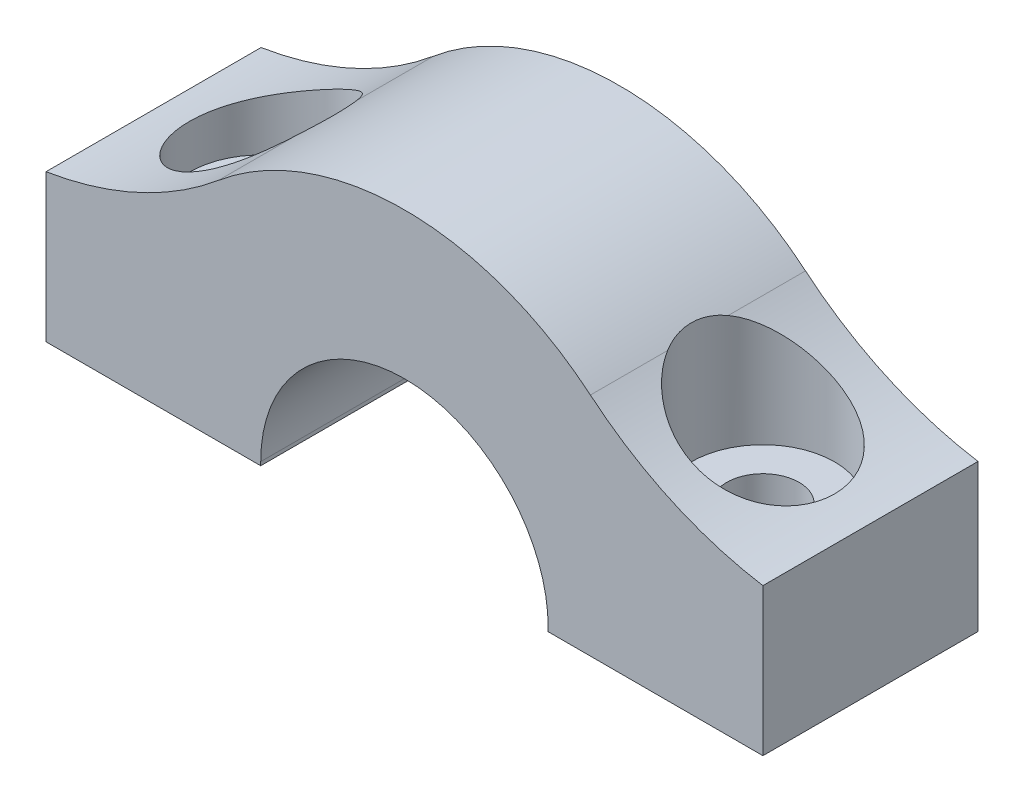
ISO-10303-21;
HEADER;
FILE_DESCRIPTION(('STEP AP214'),'2;1');
FILE_NAME('part.step','',(''),(''),'','','');
FILE_SCHEMA(('AUTOMOTIVE_DESIGN { 1 0 10303 214 1 1 1 1 }'));
ENDSEC;
DATA;
#1=APPLICATION_CONTEXT('core data for automotive mechanical design processes');
#2=APPLICATION_PROTOCOL_DEFINITION('international standard','automotive_design',2000,#1);
#3=PRODUCT_CONTEXT('',#1,'mechanical');
#4=PRODUCT('Part','Part','',(#3));
#5=PRODUCT_RELATED_PRODUCT_CATEGORY('part','',(#4));
#6=PRODUCT_DEFINITION_FORMATION('','',#4);
#7=PRODUCT_DEFINITION_CONTEXT('part definition',#1,'design');
#8=PRODUCT_DEFINITION('design','',#6,#7);
#9=PRODUCT_DEFINITION_SHAPE('','',#8);
#10=(LENGTH_UNIT() NAMED_UNIT(*) SI_UNIT(.MILLI.,.METRE.));
#11=(NAMED_UNIT(*) PLANE_ANGLE_UNIT() SI_UNIT($,.RADIAN.));
#12=(NAMED_UNIT(*) SI_UNIT($,.STERADIAN.) SOLID_ANGLE_UNIT());
#13=UNCERTAINTY_MEASURE_WITH_UNIT(LENGTH_MEASURE(1.E-05),#10,'distance_accuracy_value','');
#14=(GEOMETRIC_REPRESENTATION_CONTEXT(3) GLOBAL_UNCERTAINTY_ASSIGNED_CONTEXT((#13)) GLOBAL_UNIT_ASSIGNED_CONTEXT((#10,
#11,#12)) REPRESENTATION_CONTEXT('',''));
#15=CARTESIAN_POINT('',(0.,0.,0.));
#16=DIRECTION('',(0.,0.,1.));
#17=DIRECTION('',(1.,0.,0.));
#18=AXIS2_PLACEMENT_3D('',#15,#16,#17);
#19=CARTESIAN_POINT('',(0.,4.01,0.));
#20=DIRECTION('',(1.,0.,0.));
#21=DIRECTION('',(0.,0.,-1.));
#22=AXIS2_PLACEMENT_3D('',#19,#20,#21);
#23=PLANE('',#22);
#24=DIRECTION('',(0.,-1.,0.));
#25=VECTOR('',#24,1.);
#26=CARTESIAN_POINT('',(0.,4.01,-6.));
#27=LINE('',#26,#25);
#28=CARTESIAN_POINT('',(0.,4.01,-6.));
#29=VERTEX_POINT('',#28);
#30=CARTESIAN_POINT('',(0.,-0.1,-6.));
#31=VERTEX_POINT('',#30);
#32=EDGE_CURVE('E286',#29,#31,#27,.T.);
#33=ORIENTED_EDGE('',*,*,#32,.T.);
#34=DIRECTION('',(0.,0.,-1.));
#35=VECTOR('',#34,1.);
#36=CARTESIAN_POINT('',(0.,-0.1,0.));
#37=LINE('',#36,#35);
#38=CARTESIAN_POINT('',(0.,-0.1,0.));
#39=VERTEX_POINT('',#38);
#40=EDGE_CURVE('E176',#39,#31,#37,.T.);
#41=ORIENTED_EDGE('',*,*,#40,.F.);
#42=DIRECTION('',(0.,-1.,0.));
#43=VECTOR('',#42,1.);
#44=CARTESIAN_POINT('',(0.,4.01,0.));
#45=LINE('',#44,#43);
#46=CARTESIAN_POINT('',(0.,4.01,0.));
#47=VERTEX_POINT('',#46);
#48=EDGE_CURVE('E278',#47,#39,#45,.T.);
#49=ORIENTED_EDGE('',*,*,#48,.F.);
#50=DIRECTION('',(0.,0.,1.));
#51=VECTOR('',#50,1.);
#52=CARTESIAN_POINT('',(0.,4.01,0.));
#53=LINE('',#52,#51);
#54=EDGE_CURVE('E293',#29,#47,#53,.T.);
#55=ORIENTED_EDGE('',*,*,#54,.F.);
#56=EDGE_LOOP('',(#33,#41,#49,#55));
#57=FACE_BOUND('',#56,.T.);
#58=ADVANCED_FACE('F44',(#57),#23,.F.);
#59=CARTESIAN_POINT('',(0.,4.01,0.));
#60=DIRECTION('',(0.,0.,-1.));
#61=DIRECTION('',(-1.,0.,0.));
#62=AXIS2_PLACEMENT_3D('',#59,#60,#61);
#63=PLANE('',#62);
#64=CARTESIAN_POINT('',(10.,0.,0.));
#65=DIRECTION('',(0.,0.,1.));
#66=DIRECTION('',(1.,0.,0.));
#67=AXIS2_PLACEMENT_3D('',#64,#65,#66);
#68=CIRCLE('',#67,4.01);
#69=CARTESIAN_POINT('',(14.01,0.,0.));
#70=VERTEX_POINT('',#69);
#71=CARTESIAN_POINT('',(5.99,0.,0.));
#72=VERTEX_POINT('',#71);
#73=EDGE_CURVE('E307',#70,#72,#68,.T.);
#74=ORIENTED_EDGE('',*,*,#73,.F.);
#75=DIRECTION('',(0.,1.,0.));
#76=VECTOR('',#75,1.);
#77=CARTESIAN_POINT('',(14.01,-0.1,0.));
#78=LINE('',#77,#76);
#79=CARTESIAN_POINT('',(14.01,-0.1,0.));
#80=VERTEX_POINT('',#79);
#81=EDGE_CURVE('E170',#80,#70,#78,.T.);
#82=ORIENTED_EDGE('',*,*,#81,.F.);
#83=DIRECTION('',(-1.,0.,0.));
#84=VECTOR('',#83,1.);
#85=CARTESIAN_POINT('',(14.01,-0.1,0.));
#86=LINE('',#85,#84);
#87=CARTESIAN_POINT('',(20.,-0.1,0.));
#88=VERTEX_POINT('',#87);
#89=EDGE_CURVE('E158',#88,#80,#86,.T.);
#90=ORIENTED_EDGE('',*,*,#89,.F.);
#91=DIRECTION('',(0.,-1.,0.));
#92=VECTOR('',#91,1.);
#93=CARTESIAN_POINT('',(20.,4.01,0.));
#94=LINE('',#93,#92);
#95=CARTESIAN_POINT('',(20.,4.01,0.));
#96=VERTEX_POINT('',#95);
#97=EDGE_CURVE('E281',#96,#88,#94,.T.);
#98=ORIENTED_EDGE('',*,*,#97,.F.);
#99=CARTESIAN_POINT('',(21.5999229460773,13.8811826326239,0.));
#100=DIRECTION('',(0.,0.,-1.));
#101=DIRECTION('',(-1.,0.,0.));
#102=AXIS2_PLACEMENT_3D('',#99,#100,#101);
#103=CIRCLE('',#102,10.);
#104=CARTESIAN_POINT('',(15.1875569835116,6.20775036524,0.));
#105=VERTEX_POINT('',#104);
#106=EDGE_CURVE('E259',#96,#105,#103,.T.);
#107=ORIENTED_EDGE('',*,*,#106,.T.);
#108=CARTESIAN_POINT('',(10.,0.,0.));
#109=DIRECTION('',(0.,0.,1.));
#110=DIRECTION('',(1.,0.,0.));
#111=AXIS2_PLACEMENT_3D('',#108,#109,#110);
#112=CIRCLE('',#111,8.08992657904365);
#113=CARTESIAN_POINT('',(4.81244301648845,6.20775036524,0.));
#114=VERTEX_POINT('',#113);
#115=EDGE_CURVE('E298',#105,#114,#112,.T.);
#116=ORIENTED_EDGE('',*,*,#115,.T.);
#117=CARTESIAN_POINT('',(-1.59992294607732,13.8811826326239,0.));
#118=DIRECTION('',(0.,0.,-1.));
#119=DIRECTION('',(-1.,0.,0.));
#120=AXIS2_PLACEMENT_3D('',#117,#118,#119);
#121=CIRCLE('',#120,10.);
#122=EDGE_CURVE('E253',#114,#47,#121,.T.);
#123=ORIENTED_EDGE('',*,*,#122,.T.);
#124=ORIENTED_EDGE('',*,*,#48,.T.);
#125=DIRECTION('',(-1.,0.,0.));
#126=VECTOR('',#125,1.);
#127=CARTESIAN_POINT('',(0.,-0.1,0.));
#128=LINE('',#127,#126);
#129=CARTESIAN_POINT('',(5.99,-0.1,0.));
#130=VERTEX_POINT('',#129);
#131=EDGE_CURVE('E191',#130,#39,#128,.T.);
#132=ORIENTED_EDGE('',*,*,#131,.F.);
#133=DIRECTION('',(0.,1.,0.));
#134=VECTOR('',#133,1.);
#135=CARTESIAN_POINT('',(5.99,-0.1,0.));
#136=LINE('',#135,#134);
#137=EDGE_CURVE('E195',#130,#72,#136,.T.);
#138=ORIENTED_EDGE('',*,*,#137,.T.);
#139=EDGE_LOOP('',(#74,#82,#90,#98,#107,#116,#123,#124,#132,#138));
#140=FACE_BOUND('',#139,.T.);
#141=ADVANCED_FACE('F338',(#140),#63,.F.);
#142=CARTESIAN_POINT('',(20.,4.01,0.));
#143=DIRECTION('',(-1.,0.,0.));
#144=DIRECTION('',(0.,0.,1.));
#145=AXIS2_PLACEMENT_3D('',#142,#143,#144);
#146=PLANE('',#145);
#147=ORIENTED_EDGE('',*,*,#97,.T.);
#148=DIRECTION('',(0.,0.,1.));
#149=VECTOR('',#148,1.);
#150=CARTESIAN_POINT('',(20.,-0.1,0.));
#151=LINE('',#150,#149);
#152=CARTESIAN_POINT('',(20.,-0.1,-6.));
#153=VERTEX_POINT('',#152);
#154=EDGE_CURVE('E151',#153,#88,#151,.T.);
#155=ORIENTED_EDGE('',*,*,#154,.F.);
#156=DIRECTION('',(0.,-1.,0.));
#157=VECTOR('',#156,1.);
#158=CARTESIAN_POINT('',(20.,4.01,-6.));
#159=LINE('',#158,#157);
#160=CARTESIAN_POINT('',(20.,4.01,-6.));
#161=VERTEX_POINT('',#160);
#162=EDGE_CURVE('E146',#161,#153,#159,.T.);
#163=ORIENTED_EDGE('',*,*,#162,.F.);
#164=DIRECTION('',(0.,0.,-1.));
#165=VECTOR('',#164,1.);
#166=CARTESIAN_POINT('',(20.,4.01,0.));
#167=LINE('',#166,#165);
#168=EDGE_CURVE('E289',#96,#161,#167,.T.);
#169=ORIENTED_EDGE('',*,*,#168,.F.);
#170=EDGE_LOOP('',(#147,#155,#163,#169));
#171=FACE_BOUND('',#170,.T.);
#172=ADVANCED_FACE('F327',(#171),#146,.F.);
#173=CARTESIAN_POINT('',(0.,4.01,-6.));
#174=DIRECTION('',(0.,0.,1.));
#175=DIRECTION('',(1.,0.,0.));
#176=AXIS2_PLACEMENT_3D('',#173,#174,#175);
#177=PLANE('',#176);
#178=CARTESIAN_POINT('',(10.,0.,-6.));
#179=DIRECTION('',(0.,0.,1.));
#180=DIRECTION('',(1.,0.,0.));
#181=AXIS2_PLACEMENT_3D('',#178,#179,#180);
#182=CIRCLE('',#181,4.01);
#183=CARTESIAN_POINT('',(14.01,0.,-6.));
#184=VERTEX_POINT('',#183);
#185=CARTESIAN_POINT('',(5.99,0.,-6.));
#186=VERTEX_POINT('',#185);
#187=EDGE_CURVE('E302',#184,#186,#182,.T.);
#188=ORIENTED_EDGE('',*,*,#187,.T.);
#189=DIRECTION('',(0.,1.,0.));
#190=VECTOR('',#189,1.);
#191=CARTESIAN_POINT('',(5.99,-0.1,-6.));
#192=LINE('',#191,#190);
#193=CARTESIAN_POINT('',(5.99,-0.1,-6.));
#194=VERTEX_POINT('',#193);
#195=EDGE_CURVE('E199',#194,#186,#192,.T.);
#196=ORIENTED_EDGE('',*,*,#195,.F.);
#197=DIRECTION('',(1.,0.,0.));
#198=VECTOR('',#197,1.);
#199=CARTESIAN_POINT('',(0.,-0.1,-6.));
#200=LINE('',#199,#198);
#201=EDGE_CURVE('E185',#31,#194,#200,.T.);
#202=ORIENTED_EDGE('',*,*,#201,.F.);
#203=ORIENTED_EDGE('',*,*,#32,.F.);
#204=CARTESIAN_POINT('',(-1.59992294607732,13.8811826326239,-6.));
#205=DIRECTION('',(0.,0.,1.));
#206=DIRECTION('',(1.,0.,0.));
#207=AXIS2_PLACEMENT_3D('',#204,#205,#206);
#208=CIRCLE('',#207,10.);
#209=CARTESIAN_POINT('',(4.81244301648845,6.20775036524,-6.));
#210=VERTEX_POINT('',#209);
#211=EDGE_CURVE('E244',#29,#210,#208,.T.);
#212=ORIENTED_EDGE('',*,*,#211,.T.);
#213=CARTESIAN_POINT('',(10.,0.,-6.));
#214=DIRECTION('',(0.,0.,1.));
#215=DIRECTION('',(1.,0.,0.));
#216=AXIS2_PLACEMENT_3D('',#213,#214,#215);
#217=CIRCLE('',#216,8.08992657904365);
#218=CARTESIAN_POINT('',(15.1875569835116,6.20775036524,-6.));
#219=VERTEX_POINT('',#218);
#220=EDGE_CURVE('E297',#219,#210,#217,.T.);
#221=ORIENTED_EDGE('',*,*,#220,.F.);
#222=CARTESIAN_POINT('',(21.5999229460773,13.8811826326239,-6.));
#223=DIRECTION('',(0.,0.,1.));
#224=DIRECTION('',(1.,0.,0.));
#225=AXIS2_PLACEMENT_3D('',#222,#223,#224);
#226=CIRCLE('',#225,10.);
#227=EDGE_CURVE('E256',#219,#161,#226,.T.);
#228=ORIENTED_EDGE('',*,*,#227,.T.);
#229=ORIENTED_EDGE('',*,*,#162,.T.);
#230=DIRECTION('',(1.,0.,0.));
#231=VECTOR('',#230,1.);
#232=CARTESIAN_POINT('',(14.01,-0.1,-6.));
#233=LINE('',#232,#231);
#234=CARTESIAN_POINT('',(14.01,-0.1,-6.));
#235=VERTEX_POINT('',#234);
#236=EDGE_CURVE('E138',#235,#153,#233,.T.);
#237=ORIENTED_EDGE('',*,*,#236,.F.);
#238=DIRECTION('',(0.,1.,0.));
#239=VECTOR('',#238,1.);
#240=CARTESIAN_POINT('',(14.01,-0.1,-6.));
#241=LINE('',#240,#239);
#242=EDGE_CURVE('E143',#235,#184,#241,.T.);
#243=ORIENTED_EDGE('',*,*,#242,.T.);
#244=EDGE_LOOP('',(#188,#196,#202,#203,#212,#221,#228,#229,#237,#243));
#245=FACE_BOUND('',#244,.T.);
#246=ADVANCED_FACE('F141',(#245),#177,.F.);
#247=CARTESIAN_POINT('',(10.,0.,-8.));
#248=DIRECTION('',(0.,0.,1.));
#249=DIRECTION('',(1.,0.,0.));
#250=AXIS2_PLACEMENT_3D('',#247,#248,#249);
#251=CYLINDRICAL_SURFACE('',#250,4.01);
#252=DIRECTION('',(0.,0.,1.));
#253=VECTOR('',#252,1.);
#254=CARTESIAN_POINT('',(14.01,0.,-8.));
#255=LINE('',#254,#253);
#256=EDGE_CURVE('E167',#70,#184,#255,.F.);
#257=ORIENTED_EDGE('',*,*,#256,.F.);
#258=ORIENTED_EDGE('',*,*,#73,.T.);
#259=DIRECTION('',(0.,0.,1.));
#260=VECTOR('',#259,1.);
#261=CARTESIAN_POINT('',(5.99,0.,-8.));
#262=LINE('',#261,#260);
#263=EDGE_CURVE('E274',#186,#72,#262,.T.);
#264=ORIENTED_EDGE('',*,*,#263,.F.);
#265=ORIENTED_EDGE('',*,*,#187,.F.);
#266=EDGE_LOOP('',(#257,#258,#264,#265));
#267=FACE_BOUND('',#266,.T.);
#268=ADVANCED_FACE('F341',(#267),#251,.F.);
#269=CARTESIAN_POINT('',(10.,0.,-6.));
#270=DIRECTION('',(0.,0.,1.));
#271=DIRECTION('',(1.,0.,0.));
#272=AXIS2_PLACEMENT_3D('',#269,#270,#271);
#273=CYLINDRICAL_SURFACE('',#272,8.08992657904365);
#274=CARTESIAN_POINT('',(2.4868839983455,3.,-1.06694232655978));
#275=CARTESIAN_POINT('',(2.51785950887668,3.07757240149092,-1.05872239403562));
#276=CARTESIAN_POINT('',(2.55005072604193,3.15470374843952,-1.05097199997646));
#277=CARTESIAN_POINT('',(2.61686187510078,3.30804848556109,-1.03674409069277));
#278=CARTESIAN_POINT('',(2.65148241552104,3.38426164009189,-1.03026689595047));
#279=CARTESIAN_POINT('',(2.75927466755831,3.61207752023698,-1.01320217302098));
#280=CARTESIAN_POINT('',(2.83610450462444,3.76217345541968,-1.00505976475584));
#281=CARTESIAN_POINT('',(3.00023548427463,4.05948805850086,-0.998289534104783));
#282=CARTESIAN_POINT('',(3.08766599729466,4.20663885714986,-0.999793978404451));
#283=CARTESIAN_POINT('',(3.27121721551437,4.49437151481736,-1.01633819261925));
#284=CARTESIAN_POINT('',(3.36731808291833,4.63496730635597,-1.03134773565736));
#285=CARTESIAN_POINT('',(3.51160238955388,4.83253213865096,-1.06599768424908));
#286=CARTESIAN_POINT('',(3.55697069547141,4.89284367417651,-1.07851449712691));
#287=CARTESIAN_POINT('',(3.64888456999427,5.01157497253962,-1.10757503213509));
#288=CARTESIAN_POINT('',(3.6954302062345,5.06999462625131,-1.12411898608833));
#289=CARTESIAN_POINT('',(3.83617087789498,5.24174846024536,-1.18037696154585));
#290=CARTESIAN_POINT('',(3.93171989491276,5.35191864624695,-1.22677151189044));
#291=CARTESIAN_POINT('',(4.12410938635747,5.56249547067178,-1.34196529033274));
#292=CARTESIAN_POINT('',(4.22094897083189,5.66274159572558,-1.41107274749593));
#293=CARTESIAN_POINT('',(4.36123971778322,5.80135144950234,-1.53341451085727));
#294=CARTESIAN_POINT('',(4.40715516335388,5.84557715561414,-1.57728399675792));
#295=CARTESIAN_POINT('',(4.49635027483141,5.92962800946023,-1.67141518858411));
#296=CARTESIAN_POINT('',(4.53963152996134,5.96945582252216,-1.72167298272282));
#297=CARTESIAN_POINT('',(4.63515536220219,6.05563043548419,-1.84498555548673));
#298=CARTESIAN_POINT('',(4.68608627414177,6.1002415606766,-1.92030975185975));
#299=CARTESIAN_POINT('',(4.77879951070168,6.17978354826926,-2.0810490834287));
#300=CARTESIAN_POINT('',(4.82058583115733,6.21471864050405,-2.16645978598869));
#301=CARTESIAN_POINT('',(4.89258621923232,6.27402906334212,-2.34614196984008));
#302=CARTESIAN_POINT('',(4.92273202372132,6.29834221004594,-2.44046179960518));
#303=CARTESIAN_POINT('',(4.96888458539613,6.33527300582296,-2.63470298280579));
#304=CARTESIAN_POINT('',(4.9848972428401,6.34789553556387,-2.73462198017435));
#305=CARTESIAN_POINT('',(5.00075402292643,6.36038799947886,-2.92673819602979));
#306=CARTESIAN_POINT('',(5.00200960071267,6.36137125588637,-3.01874982541913));
#307=CARTESIAN_POINT('',(4.99191504253242,6.35342737416623,-3.2016270052352));
#308=CARTESIAN_POINT('',(4.98056826775877,6.34450287855066,-3.29249285471893));
#309=CARTESIAN_POINT('',(4.94656233103644,6.31744608332506,-3.46754213381431));
#310=CARTESIAN_POINT('',(4.92427667390951,6.29961748223267,-3.55184634625426));
#311=CARTESIAN_POINT('',(4.86987286621331,6.25539206144445,-3.71481432989337));
#312=CARTESIAN_POINT('',(4.83775398785892,6.22899460753433,-3.79347768306416));
#313=CARTESIAN_POINT('',(4.76338026943526,6.1666193200792,-3.94774399033648));
#314=CARTESIAN_POINT('',(4.72066708668205,6.13019641508656,-4.02294415841354));
#315=CARTESIAN_POINT('',(4.62834989256994,6.04946732892103,-4.16431103708679));
#316=CARTESIAN_POINT('',(4.57874177521919,6.00515644594271,-4.23047231804892));
#317=CARTESIAN_POINT('',(4.45355212489904,5.89013093139742,-4.37840930994627));
#318=CARTESIAN_POINT('',(4.37562394358567,5.81601472398225,-4.45556198828238));
#319=CARTESIAN_POINT('',(4.21546486831827,5.65675276163443,-4.59177436837993));
#320=CARTESIAN_POINT('',(4.13322895102945,5.57159395101164,-4.65081237048557));
#321=CARTESIAN_POINT('',(3.99242833714829,5.41880490139523,-4.73775413279765));
#322=CARTESIAN_POINT('',(3.93396402941265,5.35331812283771,-4.76971518998693));
#323=CARTESIAN_POINT('',(3.81772619810783,5.21865217355399,-4.82633560857608));
#324=CARTESIAN_POINT('',(3.75995299956589,5.1494713431016,-4.85099165471793));
#325=CARTESIAN_POINT('',(3.58820955731538,4.93650641927921,-4.91547604931986));
#326=CARTESIAN_POINT('',(3.47641367515265,4.78794325139579,-4.94547739872526));
#327=CARTESIAN_POINT('',(3.27998278769936,4.50697397730032,-4.98239525709779));
#328=CARTESIAN_POINT('',(3.19389676677658,4.37590186723237,-4.99228587152124));
#329=CARTESIAN_POINT('',(3.0292344219075,4.10852704312034,-5.00148583707648));
#330=CARTESIAN_POINT('',(2.95066907807953,3.97221707652626,-5.00077994757528));
#331=CARTESIAN_POINT('',(2.80320812131709,3.69822241211291,-4.99164102820663));
#332=CARTESIAN_POINT('',(2.73415329675118,3.56061688792554,-4.98335956448613));
#333=CARTESIAN_POINT('',(2.60433853477309,3.28246915209272,-4.96156214138425));
#334=CARTESIAN_POINT('',(2.54355308228544,3.14193759095928,-4.94806280085129));
#335=CARTESIAN_POINT('',(2.4868839983455,3.,-4.93305767344022));
#336=B_SPLINE_CURVE_WITH_KNOTS('',3,(#274,#275,#276,#277,#278,#279,#280,#281,#282,#283,#284,
#285,#286,#287,#288,#289,#290,#291,#292,#293,#294,#295,#296,#297,#298,#299,#300,#301,#302,#303,
#304,#305,#306,#307,#308,#309,#310,#311,#312,#313,#314,#315,#316,#317,#318,#319,#320,#321,#322,
#323,#324,#325,#326,#327,#328,#329,#330,#331,#332,#333,#334,#335),.UNSPECIFIED.,.F.,.F.,(4,2,2,
2,2,2,2,2,2,2,2,2,2,2,2,2,2,2,2,2,2,2,2,2,2,2,2,2,2,2,4),(0.,0.251771106084422,
0.503605505580252,1.0094884607697,1.52232220048578,2.03401097206225,2.2633950644783,
2.49279236454318,2.95031661812123,3.4143255153116,3.64611626659966,3.8777657618637,
4.18031514798319,4.48273206649484,4.78689644040372,5.09093377266055,5.36562440215049,
5.64024178606928,5.9060739381579,6.17192577001107,6.45232002437152,6.73288197707312,
7.12776866720442,7.52312656361375,7.80302985716557,8.08305998628064,8.64591562744668,
9.11667067173418,9.58810285363817,10.0503045078809,10.5110460291941),.UNSPECIFIED.);
#337=CARTESIAN_POINT('',(4.81244301648927,6.20775036524067,-2.15439352415951));
#338=VERTEX_POINT('',#337);
#339=CARTESIAN_POINT('',(4.81244301648845,6.20775036524,-3.84560647583984));
#340=VERTEX_POINT('',#339);
#341=EDGE_CURVE('E70',#338,#340,#336,.T.);
#342=ORIENTED_EDGE('',*,*,#341,.F.);
#343=DIRECTION('',(0.,0.,1.));
#344=VECTOR('',#343,1.);
#345=CARTESIAN_POINT('',(4.81244301648845,6.20775036524,-6.));
#346=LINE('',#345,#344);
#347=EDGE_CURVE('E271',#338,#114,#346,.T.);
#348=ORIENTED_EDGE('',*,*,#347,.T.);
#349=ORIENTED_EDGE('',*,*,#115,.F.);
#350=DIRECTION('',(0.,0.,1.));
#351=VECTOR('',#350,1.);
#352=CARTESIAN_POINT('',(15.1875569835116,6.20775036524,-6.));
#353=LINE('',#352,#351);
#354=CARTESIAN_POINT('',(15.1875569835116,6.20775036524,-2.15439352416016));
#355=VERTEX_POINT('',#354);
#356=EDGE_CURVE('E262',#105,#355,#353,.F.);
#357=ORIENTED_EDGE('',*,*,#356,.T.);
#358=CARTESIAN_POINT('',(17.5131160016545,3.,-4.93305767344022));
#359=CARTESIAN_POINT('',(17.4821404911233,3.07757240149092,-4.94127760596438));
#360=CARTESIAN_POINT('',(17.4499492739581,3.15470374843952,-4.94902800002355));
#361=CARTESIAN_POINT('',(17.3831381248992,3.30804848556109,-4.96325590930724));
#362=CARTESIAN_POINT('',(17.348517584479,3.38426164009189,-4.96973310404953));
#363=CARTESIAN_POINT('',(17.2407253324417,3.61207752023698,-4.98679782697903));
#364=CARTESIAN_POINT('',(17.1638954953756,3.76217345541968,-4.99494023524416));
#365=CARTESIAN_POINT('',(16.9997645157254,4.05948805850086,-5.00171046589522));
#366=CARTESIAN_POINT('',(16.9123340027053,4.20663885714986,-5.00020602159555));
#367=CARTESIAN_POINT('',(16.7287827844856,4.49437151481736,-4.98366180738075));
#368=CARTESIAN_POINT('',(16.6326819170817,4.63496730635597,-4.96865226434264));
#369=CARTESIAN_POINT('',(16.4883976104461,4.83253213865096,-4.93400231575092));
#370=CARTESIAN_POINT('',(16.4430293045286,4.89284367417652,-4.92148550287309));
#371=CARTESIAN_POINT('',(16.3511154300057,5.01157497253962,-4.89242496786491));
#372=CARTESIAN_POINT('',(16.3045697937655,5.06999462625132,-4.87588101391167));
#373=CARTESIAN_POINT('',(16.163829122105,5.24174846024537,-4.81962303845415));
#374=CARTESIAN_POINT('',(16.0682801050872,5.35191864624695,-4.77322848810955));
#375=CARTESIAN_POINT('',(15.8758906136425,5.56249547067178,-4.65803470966726));
#376=CARTESIAN_POINT('',(15.7790510291681,5.66274159572559,-4.58892725250406));
#377=CARTESIAN_POINT('',(15.6387602822168,5.80135144950235,-4.46658548914273));
#378=CARTESIAN_POINT('',(15.5928448366461,5.84557715561414,-4.42271600324208));
#379=CARTESIAN_POINT('',(15.5036497251686,5.92962800946024,-4.32858481141589));
#380=CARTESIAN_POINT('',(15.4603684700387,5.96945582252216,-4.27832701727718));
#381=CARTESIAN_POINT('',(15.3648446377978,6.0556304354842,-4.15501444451326));
#382=CARTESIAN_POINT('',(15.3139137258582,6.1002415606766,-4.07969024814025));
#383=CARTESIAN_POINT('',(15.2212004892983,6.17978354826926,-3.9189509165713));
#384=CARTESIAN_POINT('',(15.1794141688427,6.21471864050405,-3.83354021401131));
#385=CARTESIAN_POINT('',(15.1074137807677,6.27402906334212,-3.65385803015992));
#386=CARTESIAN_POINT('',(15.0772679762787,6.29834221004594,-3.55953820039481));
#387=CARTESIAN_POINT('',(15.0311154146039,6.33527300582297,-3.36529701719421));
#388=CARTESIAN_POINT('',(15.0151027571599,6.34789553556387,-3.26537801982565));
#389=CARTESIAN_POINT('',(14.9992459770736,6.36038799947886,-3.07326180397021));
#390=CARTESIAN_POINT('',(14.9979903992873,6.36137125588637,-2.98125017458087));
#391=CARTESIAN_POINT('',(15.0080849574676,6.35342737416624,-2.79837299476479));
#392=CARTESIAN_POINT('',(15.0194317322412,6.34450287855067,-2.70750714528107));
#393=CARTESIAN_POINT('',(15.0534376689636,6.31744608332506,-2.53245786618569));
#394=CARTESIAN_POINT('',(15.0757233260905,6.29961748223267,-2.44815365374573));
#395=CARTESIAN_POINT('',(15.1301271337867,6.25539206144445,-2.28518567010663));
#396=CARTESIAN_POINT('',(15.1622460121411,6.22899460753433,-2.20652231693584));
#397=CARTESIAN_POINT('',(15.2366197305647,6.1666193200792,-2.05225600966352));
#398=CARTESIAN_POINT('',(15.2793329133179,6.13019641508656,-1.97705584158646));
#399=CARTESIAN_POINT('',(15.3716501074301,6.04946732892103,-1.8356889629132));
#400=CARTESIAN_POINT('',(15.4212582247808,6.00515644594271,-1.76952768195107));
#401=CARTESIAN_POINT('',(15.546447875101,5.89013093139742,-1.62159069005373));
#402=CARTESIAN_POINT('',(15.6243760564143,5.81601472398225,-1.54443801171762));
#403=CARTESIAN_POINT('',(15.7845351316817,5.65675276163443,-1.40822563162006));
#404=CARTESIAN_POINT('',(15.8667710489706,5.57159395101164,-1.34918762951443));
#405=CARTESIAN_POINT('',(16.0075716628517,5.41880490139523,-1.26224586720235));
#406=CARTESIAN_POINT('',(16.0660359705874,5.35331812283771,-1.23028481001307));
#407=CARTESIAN_POINT('',(16.1822738018922,5.21865217355399,-1.17366439142391));
#408=CARTESIAN_POINT('',(16.2400470004341,5.1494713431016,-1.14900834528206));
#409=CARTESIAN_POINT('',(16.4117904426846,4.93650641927921,-1.08452395068014));
#410=CARTESIAN_POINT('',(16.5235863248474,4.78794325139579,-1.05452260127473));
#411=CARTESIAN_POINT('',(16.7200172123006,4.50697397730032,-1.0176047429022));
#412=CARTESIAN_POINT('',(16.8061032332234,4.37590186723237,-1.00771412847875));
#413=CARTESIAN_POINT('',(16.9707655780925,4.10852704312034,-0.998514162923514));
#414=CARTESIAN_POINT('',(17.0493309219205,3.97221707652626,-0.999220052424717));
#415=CARTESIAN_POINT('',(17.1967918786829,3.69822241211291,-1.00835897179337));
#416=CARTESIAN_POINT('',(17.2658467032488,3.56061688792554,-1.01664043551387));
#417=CARTESIAN_POINT('',(17.3956614652269,3.28246915209272,-1.03843785861574));
#418=CARTESIAN_POINT('',(17.4564469177146,3.14193759095927,-1.05193719914871));
#419=CARTESIAN_POINT('',(17.5131160016545,3.,-1.06694232655978));
#420=B_SPLINE_CURVE_WITH_KNOTS('',3,(#358,#359,#360,#361,#362,#363,#364,#365,#366,#367,#368,
#369,#370,#371,#372,#373,#374,#375,#376,#377,#378,#379,#380,#381,#382,#383,#384,#385,#386,#387,
#388,#389,#390,#391,#392,#393,#394,#395,#396,#397,#398,#399,#400,#401,#402,#403,#404,#405,#406,
#407,#408,#409,#410,#411,#412,#413,#414,#415,#416,#417,#418,#419),.UNSPECIFIED.,.F.,.F.,(4,2,2,
2,2,2,2,2,2,2,2,2,2,2,2,2,2,2,2,2,2,2,2,2,2,2,2,2,2,2,4),(0.,0.251771106084422,
0.503605505580252,1.0094884607697,1.52232220048578,2.03401097206225,2.26339506447831,
2.49279236454318,2.95031661812124,3.4143255153116,3.64611626659967,3.87776576186371,
4.1803151479832,4.48273206649484,4.78689644040372,5.09093377266055,5.36562440215049,
5.64024178606929,5.9060739381579,6.17192577001107,6.45232002437152,6.73288197707313,
7.12776866720443,7.52312656361376,7.80302985716558,8.08305998628065,8.64591562744669,
9.11667067173419,9.58810285363818,10.0503045078809,10.5110460291941),.UNSPECIFIED.);
#421=CARTESIAN_POINT('',(15.1875569835116,6.20775036524,-3.84560647583984));
#422=VERTEX_POINT('',#421);
#423=EDGE_CURVE('E64',#422,#355,#420,.T.);
#424=ORIENTED_EDGE('',*,*,#423,.F.);
#425=EDGE_CURVE('E266',#422,#219,#353,.F.);
#426=ORIENTED_EDGE('',*,*,#425,.T.);
#427=ORIENTED_EDGE('',*,*,#220,.T.);
#428=EDGE_CURVE('E267',#210,#340,#346,.T.);
#429=ORIENTED_EDGE('',*,*,#428,.T.);
#430=EDGE_LOOP('',(#342,#348,#349,#357,#424,#426,#427,#429));
#431=FACE_BOUND('',#430,.T.);
#432=ADVANCED_FACE('F226',(#431),#273,.T.);
#433=CARTESIAN_POINT('',(21.5999229460773,13.8811826326239,-6.));
#434=DIRECTION('',(0.,0.,-1.));
#435=DIRECTION('',(-1.,0.,0.));
#436=AXIS2_PLACEMENT_3D('',#433,#434,#435);
#437=CYLINDRICAL_SURFACE('',#436,10.);
#438=ORIENTED_EDGE('',*,*,#425,.F.);
#439=CARTESIAN_POINT('',(17.,5.00195356191332,-5.));
#440=CARTESIAN_POINT('',(17.11343706419,4.94319316218576,-4.99999334616562));
#441=CARTESIAN_POINT('',(17.2281313776991,4.8865531154992,-4.99032785436192));
#442=CARTESIAN_POINT('',(17.4568910865085,4.7789123559785,-4.95057867756549));
#443=CARTESIAN_POINT('',(17.5709550172799,4.72792175713717,-4.92045904000108));
#444=CARTESIAN_POINT('',(17.7948888098725,4.6325845870232,-4.83912481013075));
#445=CARTESIAN_POINT('',(17.9047416276935,4.58826324710872,-4.7878327262981));
#446=CARTESIAN_POINT('',(18.1152875718206,4.50728032128215,-4.66462756589405));
#447=CARTESIAN_POINT('',(18.2159881169949,4.47061249956267,-4.592731391029));
#448=CARTESIAN_POINT('',(18.3961898240459,4.40782603208461,-4.43656298923607));
#449=CARTESIAN_POINT('',(18.4767444558715,4.38109627414397,-4.35375046862899));
#450=CARTESIAN_POINT('',(18.6230650407885,4.33423363092017,-4.17432806865467));
#451=CARTESIAN_POINT('',(18.6888346458799,4.31409911600518,-4.07772160614446));
#452=CARTESIAN_POINT('',(18.7996098359582,4.28110925173688,-3.87952093511427));
#453=CARTESIAN_POINT('',(18.8455861140948,4.26790409536248,-3.77852590362835));
#454=CARTESIAN_POINT('',(18.9203047690182,4.24680850843892,-3.56983082150019));
#455=CARTESIAN_POINT('',(18.9490497536335,4.23891727364475,-3.46213178818374));
#456=CARTESIAN_POINT('',(18.9878738795281,4.22832815952159,-3.2454253822276));
#457=CARTESIAN_POINT('',(18.998317126914,4.22552893264753,-3.13648799135504));
#458=CARTESIAN_POINT('',(19.0013069353846,4.22472373612263,-2.91835141458931));
#459=CARTESIAN_POINT('',(18.9938542451869,4.22671756594329,-2.80915223983941));
#460=CARTESIAN_POINT('',(18.9613794550565,4.23554295843247,-2.59408433060022));
#461=CARTESIAN_POINT('',(18.9364330974074,4.24235366655996,-2.48820328671445));
#462=CARTESIAN_POINT('',(18.8699127776067,4.26098364851475,-2.28227197591481));
#463=CARTESIAN_POINT('',(18.828339276441,4.2728027834845,-2.18222154743587));
#464=CARTESIAN_POINT('',(18.7298704650513,4.30175537700515,-1.99044610023846));
#465=CARTESIAN_POINT('',(18.6729319013481,4.31890385894381,-1.89874557678501));
#466=CARTESIAN_POINT('',(18.5457951983491,4.35874977598958,-1.7264289858946));
#467=CARTESIAN_POINT('',(18.4755969864012,4.38144724150085,-1.64581297919602));
#468=CARTESIAN_POINT('',(18.3232420384769,4.43290725654985,-1.4964776844423));
#469=CARTESIAN_POINT('',(18.2409209424146,4.46175610002801,-1.42795611558181));
#470=CARTESIAN_POINT('',(18.0679737353847,4.5252319021412,-1.30569954103144));
#471=CARTESIAN_POINT('',(17.9773464956942,4.55985964659824,-1.25196654894631));
#472=CARTESIAN_POINT('',(17.7866921560308,4.63617082157375,-1.1580212895383));
#473=CARTESIAN_POINT('',(17.6864290066171,4.67809218449539,-1.11848340516594));
#474=CARTESIAN_POINT('',(17.4830840416688,4.7672385383742,-1.05630558886688));
#475=CARTESIAN_POINT('',(17.3800012852577,4.81446531644356,-1.03367137063967));
#476=CARTESIAN_POINT('',(17.1651345788921,4.91747893583062,-1.00363996310102));
#477=CARTESIAN_POINT('',(17.0533382787152,4.97365089236592,-0.997662723051009));
#478=CARTESIAN_POINT('',(16.8323712052415,5.0899329744042,-1.00397039891741));
#479=CARTESIAN_POINT('',(16.7232013801441,5.15004449382989,-1.01626181248406));
#480=CARTESIAN_POINT('',(16.4978009703653,5.2796099530087,-1.06030744306844));
#481=CARTESIAN_POINT('',(16.3821324376927,5.34936010072985,-1.09407128511513));
#482=CARTESIAN_POINT('',(16.1590461497545,5.48986091271378,-1.18143678611279));
#483=CARTESIAN_POINT('',(16.0516379843436,5.56061263024204,-1.23506109437695));
#484=CARTESIAN_POINT('',(15.8389017660866,5.70630794662808,-1.36636899974107));
#485=CARTESIAN_POINT('',(15.7344731217559,5.78111704807575,-1.44567000940935));
#486=CARTESIAN_POINT('',(15.5410433933762,5.92477385247049,-1.62564601255325));
#487=CARTESIAN_POINT('',(15.4520205140622,5.99362990725715,-1.72629035416818));
#488=CARTESIAN_POINT('',(15.3172052238989,6.10091612487621,-1.9149482192654));
#489=CARTESIAN_POINT('',(15.2664438424157,6.14228975873501,-1.99774919456505));
#490=CARTESIAN_POINT('',(15.1764505879048,6.21682294693412,-2.17276998461632));
#491=CARTESIAN_POINT('',(15.1372000302209,6.2499957990855,-2.26497420413514));
#492=CARTESIAN_POINT('',(15.0773997714105,6.30107687341096,-2.4423578659674));
#493=CARTESIAN_POINT('',(15.0548979007625,6.32055149001325,-2.52642232612091));
#494=CARTESIAN_POINT('',(15.0209397167945,6.35008071157468,-2.69836827162251));
#495=CARTESIAN_POINT('',(15.0094764893846,6.36014121298352,-2.78624733158342));
#496=CARTESIAN_POINT('',(14.9983534088716,6.3699017415785,-2.9635968590028));
#497=CARTESIAN_POINT('',(14.9987279166248,6.3695716083531,-3.05307120563843));
#498=CARTESIAN_POINT('',(15.0113377614246,6.35850957345826,-3.2305202403363));
#499=CARTESIAN_POINT('',(15.0235753296556,6.3477757150737,-3.3184946431243));
#500=CARTESIAN_POINT('',(15.0583457623169,6.31756828481185,-3.48690564781));
#501=CARTESIAN_POINT('',(15.0804380916509,6.29846925990309,-3.56750334994883));
#502=CARTESIAN_POINT('',(15.1336285366182,6.25305983808261,-3.72350730808794));
#503=CARTESIAN_POINT('',(15.1647322462694,6.2267449623133,-3.79891030325742));
#504=CARTESIAN_POINT('',(15.2489129896966,6.15662824182167,-3.9728431820087));
#505=CARTESIAN_POINT('',(15.3057915763541,6.11005553023983,-4.06842078548893));
#506=CARTESIAN_POINT('',(15.4320843898194,6.00944217223911,-4.24643275038502));
#507=CARTESIAN_POINT('',(15.5015166940056,5.95539078320822,-4.32884783113858));
#508=CARTESIAN_POINT('',(15.6518248613587,5.84195850424176,-4.48123011683172));
#509=CARTESIAN_POINT('',(15.7328579826533,5.78250934776291,-4.5509901011199));
#510=CARTESIAN_POINT('',(15.9038291110673,5.66135847859735,-4.67619940602029));
#511=CARTESIAN_POINT('',(15.9937720673538,5.59965552613754,-4.73164071062976));
#512=CARTESIAN_POINT('',(16.1997163517292,5.4635904069735,-4.83724648742886));
#513=CARTESIAN_POINT('',(16.3173423419219,5.38915148323064,-4.8841678030387));
#514=CARTESIAN_POINT('',(16.5604446312164,5.24268255575702,-4.95518607276695));
#515=CARTESIAN_POINT('',(16.6859016935046,5.17064726812217,-4.97933677880676));
#516=CARTESIAN_POINT('',(16.8752748016539,5.06740402319017,-4.99707021833266));
#517=CARTESIAN_POINT('',(16.9374462446964,5.0343564074237,-5.00000366919164));
#518=CARTESIAN_POINT('',(17.,5.00195356191332,-5.));
#519=B_SPLINE_CURVE_WITH_KNOTS('',3,(#439,#440,#441,#442,#443,#444,#445,#446,#447,#448,#449,
#450,#451,#452,#453,#454,#455,#456,#457,#458,#459,#460,#461,#462,#463,#464,#465,#466,#467,#468,
#469,#470,#471,#472,#473,#474,#475,#476,#477,#478,#479,#480,#481,#482,#483,#484,#485,#486,#487,
#488,#489,#490,#491,#492,#493,#494,#495,#496,#497,#498,#499,#500,#501,#502,#503,#504,#505,#506,
#507,#508,#509,#510,#511,#512,#513,#514,#515,#516,#517,#518),.UNSPECIFIED.,.T.,.F.,(4,2,2,2,2,2,
2,2,2,2,2,2,2,2,2,2,2,2,2,2,2,2,2,2,2,2,2,2,2,2,2,2,2,2,2,2,2,2,2,4),(0.,0.383062143074578,
0.766799349196711,1.15195367178071,1.53679294903825,1.89069238061725,2.24450430039568,
2.57812681242707,2.91169882040571,3.23855582126744,3.56539914755606,3.8908360091664,
4.21626384870046,4.54261751812924,4.86897297576444,5.20024951112115,5.53157113062494,
5.87702329726081,6.2225921792649,6.59683142928772,6.97120381762371,7.38714712020856,
7.80356624169512,8.2542715872471,8.70433399112852,9.0199086094999,9.33496810741034,
9.60136012429749,9.86758517694479,10.1345830597346,10.4016311687832,10.6577809753229,
10.9140901346013,11.2738706266063,11.6341733903553,11.9999279710283,12.3658868697988,
12.8046386022151,13.2423520122653,13.4535878700958),.UNSPECIFIED.);
#520=EDGE_CURVE('E11',#422,#355,#519,.T.);
#521=ORIENTED_EDGE('',*,*,#520,.T.);
#522=ORIENTED_EDGE('',*,*,#356,.F.);
#523=ORIENTED_EDGE('',*,*,#106,.F.);
#524=ORIENTED_EDGE('',*,*,#168,.T.);
#525=ORIENTED_EDGE('',*,*,#227,.F.);
#526=EDGE_LOOP('',(#438,#521,#522,#523,#524,#525));
#527=FACE_BOUND('',#526,.T.);
#528=ADVANCED_FACE('F322',(#527),#437,.F.);
#529=CARTESIAN_POINT('',(-1.59992294607732,13.8811826326239,0.));
#530=DIRECTION('',(0.,0.,-1.));
#531=DIRECTION('',(-1.,0.,0.));
#532=AXIS2_PLACEMENT_3D('',#529,#530,#531);
#533=CYLINDRICAL_SURFACE('',#532,10.);
#534=ORIENTED_EDGE('',*,*,#347,.F.);
#535=CARTESIAN_POINT('',(3.,5.00195356191333,-5.));
#536=CARTESIAN_POINT('',(3.1516106348902,5.08050633694413,-4.9999927621215));
#537=CARTESIAN_POINT('',(3.30138426963236,5.16308651470275,-4.98271648411079));
#538=CARTESIAN_POINT('',(3.59144174129662,5.33260637735493,-4.91636832396852));
#539=CARTESIAN_POINT('',(3.73169539185741,5.41955853462707,-4.86720008538713));
#540=CARTESIAN_POINT('',(3.97869001182509,5.58072533941964,-4.7487427210377));
#541=CARTESIAN_POINT('',(4.08733954430619,5.65495538286359,-4.68341416760664));
#542=CARTESIAN_POINT('',(4.29167046938091,5.8000466342333,-4.53222129660891));
#543=CARTESIAN_POINT('',(4.38737466724956,5.87091361983773,-4.44639384902562));
#544=CARTESIAN_POINT('',(4.54442364686559,5.99102011867124,-4.27487357291598));
#545=CARTESIAN_POINT('',(4.60876667346162,6.04168081983747,-4.19291685371314));
#546=CARTESIAN_POINT('',(4.72537817102907,6.13546464429946,-4.0169424724806));
#547=CARTESIAN_POINT('',(4.77766246165073,6.17859762478981,-3.92294086683676));
#548=CARTESIAN_POINT('',(4.85886658266327,6.2466363377167,-3.74322157353561));
#549=CARTESIAN_POINT('',(4.89034650123646,6.27345241342029,-3.65939162463008));
#550=CARTESIAN_POINT('',(4.94214766208233,6.31795003903475,-3.48602904943209));
#551=CARTESIAN_POINT('',(4.9624781956067,6.33563919406304,-3.39650124106439));
#552=CARTESIAN_POINT('',(4.990739218202,6.36030891722107,-3.21347602069228));
#553=CARTESIAN_POINT('',(4.99859746046984,6.36722708915221,-3.11995867967587));
#554=CARTESIAN_POINT('',(5.00105695491412,6.36938722547871,-2.93262040168597));
#555=CARTESIAN_POINT('',(4.99566094111834,6.36463159789257,-2.83879953131009));
#556=CARTESIAN_POINT('',(4.97314137471459,6.34493624729057,-2.66252544659994));
#557=CARTESIAN_POINT('',(4.95712954536536,6.33096251298055,-2.57981463113812));
#558=CARTESIAN_POINT('',(4.91547104642003,6.29498498180852,-2.41870413322481));
#559=CARTESIAN_POINT('',(4.88981997754768,6.2729775185444,-2.34030643800643));
#560=CARTESIAN_POINT('',(4.82038688121039,6.2142220148288,-2.16468501945544));
#561=CARTESIAN_POINT('',(4.77342550453806,6.17500905659205,-2.06954348307996));
#562=CARTESIAN_POINT('',(4.66726047218224,6.08842224219602,-1.89043686950712));
#563=CARTESIAN_POINT('',(4.6080336142793,6.04103294789342,-1.80649347761851));
#564=CARTESIAN_POINT('',(4.46329570504102,5.92833824442491,-1.630777585702));
#565=CARTESIAN_POINT('',(4.37491944513789,5.86152277703984,-1.54233616175872));
#566=CARTESIAN_POINT('',(4.18543337740216,5.72376839480965,-1.38445811112553));
#567=CARTESIAN_POINT('',(4.08431692074738,5.65282733739662,-1.31503146830449));
#568=CARTESIAN_POINT('',(3.87075541883887,5.50930297787209,-1.19531336930158));
#569=CARTESIAN_POINT('',(3.7582158028243,5.43671061137933,-1.14520147884754));
#570=CARTESIAN_POINT('',(3.52494130273811,5.29313727818725,-1.06619616093997));
#571=CARTESIAN_POINT('',(3.40420670850832,5.22215625461597,-1.03730198348032));
#572=CARTESIAN_POINT('',(3.15089421320771,5.08051079257127,-1.00139737108622));
#573=CARTESIAN_POINT('',(3.01802650779721,5.0100496897228,-0.995586576171786));
#574=CARTESIAN_POINT('',(2.75044302164717,4.87581372128238,-1.01111983655273));
#575=CARTESIAN_POINT('',(2.61572819417935,4.81203554349074,-1.03245037046859));
#576=CARTESIAN_POINT('',(2.36206450478737,4.6985792766847,-1.10034805939738));
#577=CARTESIAN_POINT('',(2.24279584000109,4.64814641908503,-1.14444428698696));
#578=CARTESIAN_POINT('',(2.01234089114107,4.55557573435998,-1.25618740040357));
#579=CARTESIAN_POINT('',(1.90114760418249,4.51343066464254,-1.32381357927076));
#580=CARTESIAN_POINT('',(1.704221936229,4.44230834724928,-1.47213197986648));
#581=CARTESIAN_POINT('',(1.61703205570178,4.41237543533126,-1.55043763033436));
#582=CARTESIAN_POINT('',(1.45680139605465,4.3594409299853,-1.72237529352258));
#583=CARTESIAN_POINT('',(1.3837547730853,4.33643647159913,-1.81600094654274));
#584=CARTESIAN_POINT('',(1.25934626836507,4.29846191396342,-2.00884535454433));
#585=CARTESIAN_POINT('',(1.20684246932924,4.28304971086387,-2.10724282479881));
#586=CARTESIAN_POINT('',(1.11875945879605,4.2577280443803,-2.31199823976149));
#587=CARTESIAN_POINT('',(1.08317730552988,4.24781762448038,-2.41835479708675));
#588=CARTESIAN_POINT('',(1.03091940686806,4.23341659988903,-2.63308660140798));
#589=CARTESIAN_POINT('',(1.01378712880186,4.22879493671494,-2.74134227501165));
#590=CARTESIAN_POINT('',(0.997430877886162,4.2243804682425,-2.95929471780354));
#591=CARTESIAN_POINT('',(0.998206007443266,4.22458742091394,-3.06899141448626));
#592=CARTESIAN_POINT('',(1.01757731168198,4.22982062504837,-3.28599855338022));
#593=CARTESIAN_POINT('',(1.03606389261837,4.23481723946112,-3.39331952001723));
#594=CARTESIAN_POINT('',(1.09006263506642,4.24973648502275,-3.60322667587433));
#595=CARTESIAN_POINT('',(1.12557435897672,4.25965898956053,-3.70581298671613));
#596=CARTESIAN_POINT('',(1.21245916788286,4.2846967141119,-3.9035351966411));
#597=CARTESIAN_POINT('',(1.26385638470024,4.29981983840629,-3.99865948253799));
#598=CARTESIAN_POINT('',(1.38068462143362,4.33551895088501,-4.17870014335335));
#599=CARTESIAN_POINT('',(1.44611504008276,4.35609470545472,-4.26361695537829));
#600=CARTESIAN_POINT('',(1.58956278145113,4.40315911919655,-4.42204787540196));
#601=CARTESIAN_POINT('',(1.66771909289115,4.42971447621457,-4.49541612489012));
#602=CARTESIAN_POINT('',(1.83335122046376,4.48861401324462,-4.62793951045927));
#603=CARTESIAN_POINT('',(1.9208299144602,4.52095998295368,-4.68709023907149));
#604=CARTESIAN_POINT('',(2.10554311440254,4.59249721458329,-4.79210670842479));
#605=CARTESIAN_POINT('',(2.20301741763304,4.63189557472772,-4.83740741569753));
#606=CARTESIAN_POINT('',(2.40174585867179,4.71612539711358,-4.91136765025971));
#607=CARTESIAN_POINT('',(2.5029974578108,4.76095325421455,-4.94003814743738));
#608=CARTESIAN_POINT('',(2.67059417647341,4.83861806102586,-4.97383212001372));
#609=CARTESIAN_POINT('',(2.73665651394485,4.87010834576941,-4.98369399524149));
#610=CARTESIAN_POINT('',(2.86859365171411,4.93479932055955,-4.99677991757921));
#611=CARTESIAN_POINT('',(2.93446842734283,4.96800022553899,-5.00000312847157));
#612=CARTESIAN_POINT('',(3.,5.00195356191333,-5.));
#613=B_SPLINE_CURVE_WITH_KNOTS('',3,(#535,#536,#537,#538,#539,#540,#541,#542,#543,#544,#545,
#546,#547,#548,#549,#550,#551,#552,#553,#554,#555,#556,#557,#558,#559,#560,#561,#562,#563,#564,
#565,#566,#567,#568,#569,#570,#571,#572,#573,#574,#575,#576,#577,#578,#579,#580,#581,#582,#583,
#584,#585,#586,#587,#588,#589,#590,#591,#592,#593,#594,#595,#596,#597,#598,#599,#600,#601,#602,
#603,#604,#605,#606,#607,#608,#609,#610,#611,#612),.UNSPECIFIED.,.T.,.F.,(4,2,2,2,2,2,2,2,2,2,2,
2,2,2,2,2,2,2,2,2,2,2,2,2,2,2,2,2,2,2,2,2,2,2,2,2,2,2,4),(0.,0.511888118971539,1.02533007564697,
1.46418438819402,1.90225522972608,2.24858295765669,2.5944537265006,2.87375619784663,
3.15282555962808,3.43350563057734,3.71412780897765,3.96921706005199,4.22442287361156,
4.56193039700899,4.90008230198768,5.32318583341588,5.74651109482745,6.17368210590455,
6.60083801656553,7.04992358798227,7.49878551966073,7.90683559686278,8.31452748400338,
8.67548279216428,9.0362886375074,9.37240196717002,9.7084568433286,10.0359903483189,
10.3635074360098,10.6890109364946,11.0145060709329,11.3404981192206,11.6664762028355,
11.9962882489708,12.3262024062192,12.6681833104375,13.0099383743877,13.2311669769229,
13.4524234440897),.UNSPECIFIED.);
#614=EDGE_CURVE('E58',#338,#340,#613,.T.);
#615=ORIENTED_EDGE('',*,*,#614,.T.);
#616=ORIENTED_EDGE('',*,*,#428,.F.);
#617=ORIENTED_EDGE('',*,*,#211,.F.);
#618=ORIENTED_EDGE('',*,*,#54,.T.);
#619=ORIENTED_EDGE('',*,*,#122,.F.);
#620=EDGE_LOOP('',(#534,#615,#616,#617,#618,#619));
#621=FACE_BOUND('',#620,.T.);
#622=ADVANCED_FACE('F46',(#621),#533,.F.);
#623=CARTESIAN_POINT('',(3.,8.08992657904365,-3.));
#624=DIRECTION('',(0.,-1.,0.));
#625=DIRECTION('',(0.,0.,-1.));
#626=AXIS2_PLACEMENT_3D('',#623,#624,#625);
#627=CYLINDRICAL_SURFACE('',#626,1.01);
#628=CARTESIAN_POINT('',(3.,3.,-3.));
#629=DIRECTION('',(0.,-1.,0.));
#630=DIRECTION('',(0.,0.,-1.));
#631=AXIS2_PLACEMENT_3D('',#628,#629,#630);
#632=CIRCLE('',#631,1.01);
#633=CARTESIAN_POINT('',(3.,3.,-4.01));
#634=VERTEX_POINT('',#633);
#635=EDGE_CURVE('E220',#634,#634,#632,.F.);
#636=ORIENTED_EDGE('',*,*,#635,.T.);
#637=EDGE_LOOP('',(#636));
#638=FACE_BOUND('',#637,.T.);
#639=CARTESIAN_POINT('',(3.,-0.1,-3.));
#640=DIRECTION('',(0.,-1.,0.));
#641=DIRECTION('',(0.,0.,-1.));
#642=AXIS2_PLACEMENT_3D('',#639,#640,#641);
#643=CIRCLE('',#642,1.01);
#644=CARTESIAN_POINT('',(3.,-0.1,-4.01));
#645=VERTEX_POINT('',#644);
#646=EDGE_CURVE('E169',#645,#645,#643,.T.);
#647=ORIENTED_EDGE('',*,*,#646,.T.);
#648=EDGE_LOOP('',(#647));
#649=FACE_BOUND('',#648,.T.);
#650=ADVANCED_FACE('F359',(#638,#649),#627,.F.);
#651=CARTESIAN_POINT('',(17.,8.08992657904365,-3.));
#652=DIRECTION('',(0.,-1.,0.));
#653=DIRECTION('',(0.,0.,-1.));
#654=AXIS2_PLACEMENT_3D('',#651,#652,#653);
#655=CYLINDRICAL_SURFACE('',#654,1.01);
#656=CARTESIAN_POINT('',(17.,3.,-3.));
#657=DIRECTION('',(0.,-1.,0.));
#658=DIRECTION('',(0.,0.,-1.));
#659=AXIS2_PLACEMENT_3D('',#656,#657,#658);
#660=CIRCLE('',#659,1.01);
#661=CARTESIAN_POINT('',(17.,3.,-4.01));
#662=VERTEX_POINT('',#661);
#663=EDGE_CURVE('E208',#662,#662,#660,.F.);
#664=ORIENTED_EDGE('',*,*,#663,.T.);
#665=EDGE_LOOP('',(#664));
#666=FACE_BOUND('',#665,.T.);
#667=CARTESIAN_POINT('',(17.,-0.1,-3.));
#668=DIRECTION('',(0.,-1.,0.));
#669=DIRECTION('',(0.,0.,-1.));
#670=AXIS2_PLACEMENT_3D('',#667,#668,#669);
#671=CIRCLE('',#670,1.01);
#672=CARTESIAN_POINT('',(17.,-0.1,-4.01));
#673=VERTEX_POINT('',#672);
#674=EDGE_CURVE('E163',#673,#673,#671,.T.);
#675=ORIENTED_EDGE('',*,*,#674,.T.);
#676=EDGE_LOOP('',(#675));
#677=FACE_BOUND('',#676,.T.);
#678=ADVANCED_FACE('F362',(#666,#677),#655,.F.);
#679=CARTESIAN_POINT('',(17.,3.,-3.));
#680=DIRECTION('',(0.,-1.,0.));
#681=DIRECTION('',(0.,0.,-1.));
#682=AXIS2_PLACEMENT_3D('',#679,#680,#681);
#683=PLANE('',#682);
#684=CARTESIAN_POINT('',(17.,3.,-3.));
#685=DIRECTION('',(0.,-1.,0.));
#686=DIRECTION('',(0.,0.,-1.));
#687=AXIS2_PLACEMENT_3D('',#684,#685,#686);
#688=CIRCLE('',#687,2.);
#689=CARTESIAN_POINT('',(17.,3.,-5.));
#690=VERTEX_POINT('',#689);
#691=EDGE_CURVE('E203',#690,#690,#688,.T.);
#692=ORIENTED_EDGE('',*,*,#691,.F.);
#693=EDGE_LOOP('',(#692));
#694=FACE_BOUND('',#693,.T.);
#695=ORIENTED_EDGE('',*,*,#663,.F.);
#696=EDGE_LOOP('',(#695));
#697=FACE_BOUND('',#696,.T.);
#698=ADVANCED_FACE('F238',(#694,#697),#683,.F.);
#699=CARTESIAN_POINT('',(17.,13.,-3.));
#700=DIRECTION('',(0.,-1.,0.));
#701=DIRECTION('',(0.,0.,-1.));
#702=AXIS2_PLACEMENT_3D('',#699,#700,#701);
#703=CYLINDRICAL_SURFACE('',#702,2.);
#704=ORIENTED_EDGE('',*,*,#423,.T.);
#705=ORIENTED_EDGE('',*,*,#520,.F.);
#706=EDGE_LOOP('',(#704,#705));
#707=FACE_BOUND('',#706,.T.);
#708=ORIENTED_EDGE('',*,*,#691,.T.);
#709=EDGE_LOOP('',(#708));
#710=FACE_BOUND('',#709,.T.);
#711=ADVANCED_FACE('F356',(#707,#710),#703,.F.);
#712=CARTESIAN_POINT('',(3.,3.,-3.));
#713=DIRECTION('',(0.,-1.,0.));
#714=DIRECTION('',(0.,0.,-1.));
#715=AXIS2_PLACEMENT_3D('',#712,#713,#714);
#716=PLANE('',#715);
#717=CARTESIAN_POINT('',(3.,3.,-3.));
#718=DIRECTION('',(0.,-1.,0.));
#719=DIRECTION('',(0.,0.,-1.));
#720=AXIS2_PLACEMENT_3D('',#717,#718,#719);
#721=CIRCLE('',#720,2.);
#722=CARTESIAN_POINT('',(3.,3.,-5.));
#723=VERTEX_POINT('',#722);
#724=EDGE_CURVE('E204',#723,#723,#721,.T.);
#725=ORIENTED_EDGE('',*,*,#724,.F.);
#726=EDGE_LOOP('',(#725));
#727=FACE_BOUND('',#726,.T.);
#728=ORIENTED_EDGE('',*,*,#635,.F.);
#729=EDGE_LOOP('',(#728));
#730=FACE_BOUND('',#729,.T.);
#731=ADVANCED_FACE('F236',(#727,#730),#716,.F.);
#732=CARTESIAN_POINT('',(3.,13.,-3.));
#733=DIRECTION('',(0.,-1.,0.));
#734=DIRECTION('',(0.,0.,-1.));
#735=AXIS2_PLACEMENT_3D('',#732,#733,#734);
#736=CYLINDRICAL_SURFACE('',#735,2.);
#737=ORIENTED_EDGE('',*,*,#341,.T.);
#738=ORIENTED_EDGE('',*,*,#614,.F.);
#739=EDGE_LOOP('',(#737,#738));
#740=FACE_BOUND('',#739,.T.);
#741=ORIENTED_EDGE('',*,*,#724,.T.);
#742=EDGE_LOOP('',(#741));
#743=FACE_BOUND('',#742,.T.);
#744=ADVANCED_FACE('F230',(#740,#743),#736,.F.);
#745=CARTESIAN_POINT('',(0.,-0.1,0.));
#746=DIRECTION('',(0.,-1.,0.));
#747=DIRECTION('',(0.,0.,-1.));
#748=AXIS2_PLACEMENT_3D('',#745,#746,#747);
#749=PLANE('',#748);
#750=ORIENTED_EDGE('',*,*,#40,.T.);
#751=ORIENTED_EDGE('',*,*,#201,.T.);
#752=DIRECTION('',(0.,0.,1.));
#753=VECTOR('',#752,1.);
#754=CARTESIAN_POINT('',(5.99,-0.1,0.));
#755=LINE('',#754,#753);
#756=EDGE_CURVE('E188',#194,#130,#755,.T.);
#757=ORIENTED_EDGE('',*,*,#756,.T.);
#758=ORIENTED_EDGE('',*,*,#131,.T.);
#759=EDGE_LOOP('',(#750,#751,#757,#758));
#760=FACE_BOUND('',#759,.T.);
#761=ORIENTED_EDGE('',*,*,#646,.F.);
#762=EDGE_LOOP('',(#761));
#763=FACE_BOUND('',#762,.T.);
#764=ADVANCED_FACE('F235',(#760,#763),#749,.T.);
#765=CARTESIAN_POINT('',(5.99,-0.1,0.));
#766=DIRECTION('',(-1.,0.,0.));
#767=DIRECTION('',(0.,0.,1.));
#768=AXIS2_PLACEMENT_3D('',#765,#766,#767);
#769=PLANE('',#768);
#770=ORIENTED_EDGE('',*,*,#263,.T.);
#771=ORIENTED_EDGE('',*,*,#137,.F.);
#772=ORIENTED_EDGE('',*,*,#756,.F.);
#773=ORIENTED_EDGE('',*,*,#195,.T.);
#774=EDGE_LOOP('',(#770,#771,#772,#773));
#775=FACE_BOUND('',#774,.T.);
#776=ADVANCED_FACE('F346',(#775),#769,.F.);
#777=CARTESIAN_POINT('',(0.,-0.1,0.));
#778=DIRECTION('',(0.,-1.,0.));
#779=DIRECTION('',(0.,0.,-1.));
#780=AXIS2_PLACEMENT_3D('',#777,#778,#779);
#781=PLANE('',#780);
#782=DIRECTION('',(0.,0.,-1.));
#783=VECTOR('',#782,1.);
#784=CARTESIAN_POINT('',(14.01,-0.1,0.));
#785=LINE('',#784,#783);
#786=EDGE_CURVE('E152',#80,#235,#785,.T.);
#787=ORIENTED_EDGE('',*,*,#786,.T.);
#788=ORIENTED_EDGE('',*,*,#236,.T.);
#789=ORIENTED_EDGE('',*,*,#154,.T.);
#790=ORIENTED_EDGE('',*,*,#89,.T.);
#791=EDGE_LOOP('',(#787,#788,#789,#790));
#792=FACE_BOUND('',#791,.T.);
#793=ORIENTED_EDGE('',*,*,#674,.F.);
#794=EDGE_LOOP('',(#793));
#795=FACE_BOUND('',#794,.T.);
#796=ADVANCED_FACE('F155',(#792,#795),#781,.T.);
#797=CARTESIAN_POINT('',(14.01,-0.1,0.));
#798=DIRECTION('',(1.,0.,0.));
#799=DIRECTION('',(0.,0.,-1.));
#800=AXIS2_PLACEMENT_3D('',#797,#798,#799);
#801=PLANE('',#800);
#802=ORIENTED_EDGE('',*,*,#256,.T.);
#803=ORIENTED_EDGE('',*,*,#242,.F.);
#804=ORIENTED_EDGE('',*,*,#786,.F.);
#805=ORIENTED_EDGE('',*,*,#81,.T.);
#806=EDGE_LOOP('',(#802,#803,#804,#805));
#807=FACE_BOUND('',#806,.T.);
#808=ADVANCED_FACE('F165',(#807),#801,.F.);
#809=CLOSED_SHELL('',(#58,#141,#172,#246,#268,#432,#528,#622,#650,#678,#698,#711,#731,#744,#764,
#776,#796,#808));
#810=MANIFOLD_SOLID_BREP('B2',#809);
#811=ADVANCED_BREP_SHAPE_REPRESENTATION('',(#18,#810),#14);
#812=SHAPE_DEFINITION_REPRESENTATION(#9,#811);
ENDSEC;
END-ISO-10303-21;
